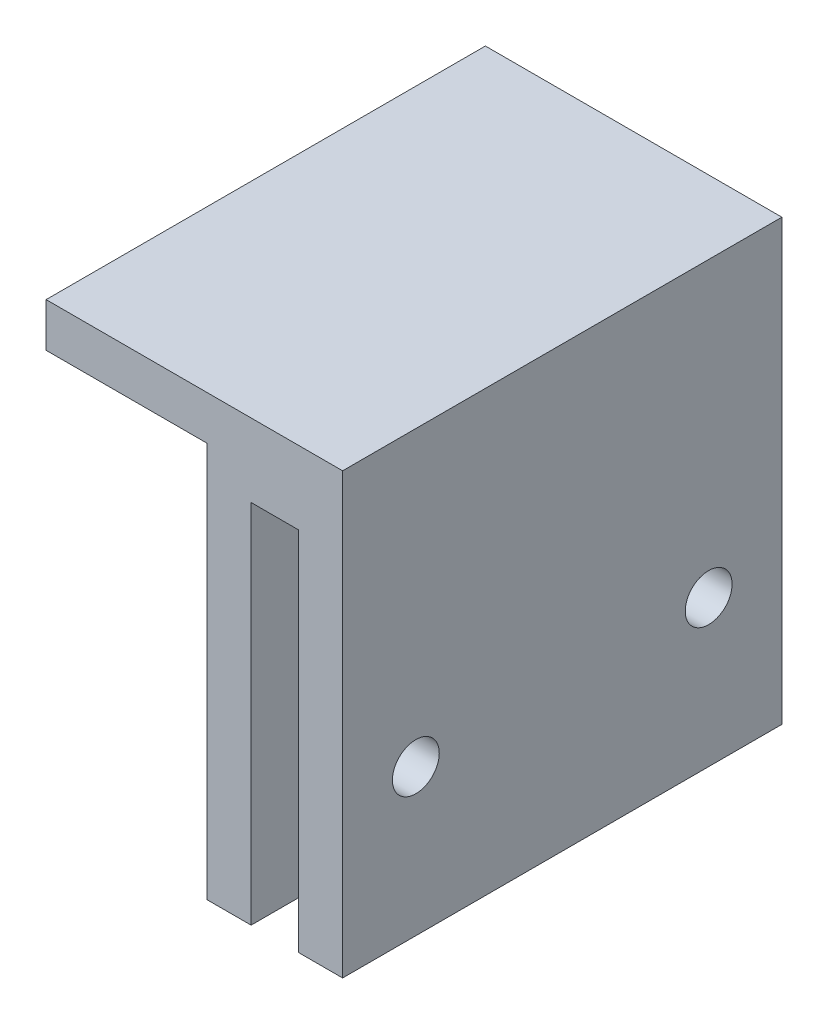
ISO-10303-21;
HEADER;
FILE_DESCRIPTION(('STEP AP214'),'2;1');
FILE_NAME('part.step','',(''),(''),'','','');
FILE_SCHEMA(('AUTOMOTIVE_DESIGN { 1 0 10303 214 1 1 1 1 }'));
ENDSEC;
DATA;
#1=APPLICATION_CONTEXT('core data for automotive mechanical design processes');
#2=APPLICATION_PROTOCOL_DEFINITION('international standard','automotive_design',2000,#1);
#3=PRODUCT_CONTEXT('',#1,'mechanical');
#4=PRODUCT('Part','Part','',(#3));
#5=PRODUCT_RELATED_PRODUCT_CATEGORY('part','',(#4));
#6=PRODUCT_DEFINITION_FORMATION('','',#4);
#7=PRODUCT_DEFINITION_CONTEXT('part definition',#1,'design');
#8=PRODUCT_DEFINITION('design','',#6,#7);
#9=PRODUCT_DEFINITION_SHAPE('','',#8);
#10=(LENGTH_UNIT() NAMED_UNIT(*) SI_UNIT(.MILLI.,.METRE.));
#11=(NAMED_UNIT(*) PLANE_ANGLE_UNIT() SI_UNIT($,.RADIAN.));
#12=(NAMED_UNIT(*) SI_UNIT($,.STERADIAN.) SOLID_ANGLE_UNIT());
#13=UNCERTAINTY_MEASURE_WITH_UNIT(LENGTH_MEASURE(1.E-05),#10,'distance_accuracy_value','');
#14=(GEOMETRIC_REPRESENTATION_CONTEXT(3) GLOBAL_UNCERTAINTY_ASSIGNED_CONTEXT((#13)) GLOBAL_UNIT_ASSIGNED_CONTEXT((#10,
#11,#12)) REPRESENTATION_CONTEXT('',''));
#15=CARTESIAN_POINT('',(0.,0.,0.));
#16=DIRECTION('',(0.,0.,1.));
#17=DIRECTION('',(1.,0.,0.));
#18=AXIS2_PLACEMENT_3D('',#15,#16,#17);
#19=CARTESIAN_POINT('',(-9.25,0.,0.));
#20=DIRECTION('',(1.,0.,0.));
#21=DIRECTION('',(0.,0.,-1.));
#22=AXIS2_PLACEMENT_3D('',#19,#20,#21);
#23=PLANE('',#22);
#24=CARTESIAN_POINT('',(-9.25,10.,-5.));
#25=DIRECTION('',(1.,0.,0.));
#26=DIRECTION('',(0.,0.,-1.));
#27=AXIS2_PLACEMENT_3D('',#24,#25,#26);
#28=CIRCLE('',#27,1.6);
#29=CARTESIAN_POINT('',(-9.25,10.,-6.6));
#30=VERTEX_POINT('',#29);
#31=EDGE_CURVE('E184',#30,#30,#28,.T.);
#32=ORIENTED_EDGE('',*,*,#31,.T.);
#33=EDGE_LOOP('',(#32));
#34=FACE_BOUND('',#33,.T.);
#35=CARTESIAN_POINT('',(-9.25,10.,-25.));
#36=DIRECTION('',(1.,0.,0.));
#37=DIRECTION('',(0.,0.,-1.));
#38=AXIS2_PLACEMENT_3D('',#35,#36,#37);
#39=CIRCLE('',#38,1.6);
#40=CARTESIAN_POINT('',(-9.25,10.,-26.6));
#41=VERTEX_POINT('',#40);
#42=EDGE_CURVE('E178',#41,#41,#39,.T.);
#43=ORIENTED_EDGE('',*,*,#42,.T.);
#44=EDGE_LOOP('',(#43));
#45=FACE_BOUND('',#44,.T.);
#46=DIRECTION('',(0.,0.,1.));
#47=VECTOR('',#46,1.);
#48=CARTESIAN_POINT('',(-9.25,27.,-30.));
#49=LINE('',#48,#47);
#50=CARTESIAN_POINT('',(-9.25,27.,-30.));
#51=VERTEX_POINT('',#50);
#52=CARTESIAN_POINT('',(-9.25,27.,0.));
#53=VERTEX_POINT('',#52);
#54=EDGE_CURVE('E51',#51,#53,#49,.T.);
#55=ORIENTED_EDGE('',*,*,#54,.F.);
#56=DIRECTION('',(0.,1.,0.));
#57=VECTOR('',#56,1.);
#58=CARTESIAN_POINT('',(-9.25,0.,-30.));
#59=LINE('',#58,#57);
#60=CARTESIAN_POINT('',(-9.25,0.,-30.));
#61=VERTEX_POINT('',#60);
#62=EDGE_CURVE('E195',#61,#51,#59,.T.);
#63=ORIENTED_EDGE('',*,*,#62,.F.);
#64=DIRECTION('',(0.,0.,-1.));
#65=VECTOR('',#64,1.);
#66=CARTESIAN_POINT('',(-9.25,0.,0.));
#67=LINE('',#66,#65);
#68=CARTESIAN_POINT('',(-9.25,0.,0.));
#69=VERTEX_POINT('',#68);
#70=EDGE_CURVE('E192',#69,#61,#67,.T.);
#71=ORIENTED_EDGE('',*,*,#70,.F.);
#72=DIRECTION('',(0.,-1.,0.));
#73=VECTOR('',#72,1.);
#74=CARTESIAN_POINT('',(-9.25,30.,0.));
#75=LINE('',#74,#73);
#76=EDGE_CURVE('E190',#53,#69,#75,.T.);
#77=ORIENTED_EDGE('',*,*,#76,.F.);
#78=EDGE_LOOP('',(#55,#63,#71,#77));
#79=FACE_BOUND('',#78,.T.);
#80=ADVANCED_FACE('F34',(#34,#45,#79),#23,.F.);
#81=CARTESIAN_POINT('',(-9.25,0.,0.));
#82=DIRECTION('',(0.,-1.,0.));
#83=DIRECTION('',(0.,0.,-1.));
#84=AXIS2_PLACEMENT_3D('',#81,#82,#83);
#85=PLANE('',#84);
#86=DIRECTION('',(0.,0.,1.));
#87=VECTOR('',#86,1.);
#88=CARTESIAN_POINT('',(-6.25000000000001,0.,-30.));
#89=LINE('',#88,#87);
#90=CARTESIAN_POINT('',(-6.25000000000001,0.,-30.));
#91=VERTEX_POINT('',#90);
#92=CARTESIAN_POINT('',(-6.25000000000001,0.,0.));
#93=VERTEX_POINT('',#92);
#94=EDGE_CURVE('E162',#91,#93,#89,.T.);
#95=ORIENTED_EDGE('',*,*,#94,.T.);
#96=DIRECTION('',(1.,0.,0.));
#97=VECTOR('',#96,1.);
#98=CARTESIAN_POINT('',(-9.25,0.,0.));
#99=LINE('',#98,#97);
#100=EDGE_CURVE('E209',#69,#93,#99,.T.);
#101=ORIENTED_EDGE('',*,*,#100,.F.);
#102=ORIENTED_EDGE('',*,*,#70,.T.);
#103=DIRECTION('',(1.,0.,0.));
#104=VECTOR('',#103,1.);
#105=CARTESIAN_POINT('',(-9.25,0.,-30.));
#106=LINE('',#105,#104);
#107=EDGE_CURVE('E122',#61,#91,#106,.T.);
#108=ORIENTED_EDGE('',*,*,#107,.T.);
#109=EDGE_LOOP('',(#95,#101,#102,#108));
#110=FACE_BOUND('',#109,.T.);
#111=ADVANCED_FACE('F254',(#110),#85,.T.);
#112=CARTESIAN_POINT('',(-9.25,10.,-5.));
#113=DIRECTION('',(1.,0.,0.));
#114=DIRECTION('',(0.,0.,-1.));
#115=AXIS2_PLACEMENT_3D('',#112,#113,#114);
#116=CYLINDRICAL_SURFACE('',#115,1.6);
#117=CARTESIAN_POINT('',(-6.25000000000001,10.,-5.));
#118=DIRECTION('',(-1.,0.,0.));
#119=DIRECTION('',(0.,0.,1.));
#120=AXIS2_PLACEMENT_3D('',#117,#118,#119);
#121=CIRCLE('',#120,1.6);
#122=CARTESIAN_POINT('',(-6.25000000000001,10.,-3.4));
#123=VERTEX_POINT('',#122);
#124=EDGE_CURVE('E174',#123,#123,#121,.F.);
#125=ORIENTED_EDGE('',*,*,#124,.T.);
#126=EDGE_LOOP('',(#125));
#127=FACE_BOUND('',#126,.T.);
#128=ORIENTED_EDGE('',*,*,#31,.F.);
#129=EDGE_LOOP('',(#128));
#130=FACE_BOUND('',#129,.T.);
#131=ADVANCED_FACE('F232',(#127,#130),#116,.F.);
#132=CARTESIAN_POINT('',(-9.25,10.,-25.));
#133=DIRECTION('',(1.,0.,0.));
#134=DIRECTION('',(0.,0.,-1.));
#135=AXIS2_PLACEMENT_3D('',#132,#133,#134);
#136=CYLINDRICAL_SURFACE('',#135,1.6);
#137=CARTESIAN_POINT('',(-6.25000000000001,10.,-25.));
#138=DIRECTION('',(-1.,0.,0.));
#139=DIRECTION('',(0.,0.,1.));
#140=AXIS2_PLACEMENT_3D('',#137,#138,#139);
#141=CIRCLE('',#140,1.6);
#142=CARTESIAN_POINT('',(-6.25000000000001,10.,-23.4));
#143=VERTEX_POINT('',#142);
#144=EDGE_CURVE('E38',#143,#143,#141,.F.);
#145=ORIENTED_EDGE('',*,*,#144,.T.);
#146=EDGE_LOOP('',(#145));
#147=FACE_BOUND('',#146,.T.);
#148=ORIENTED_EDGE('',*,*,#42,.F.);
#149=EDGE_LOOP('',(#148));
#150=FACE_BOUND('',#149,.T.);
#151=ADVANCED_FACE('F301',(#147,#150),#136,.F.);
#152=CARTESIAN_POINT('',(-9.25,30.,0.));
#153=DIRECTION('',(0.,0.,1.));
#154=DIRECTION('',(0.,-1.,0.));
#155=AXIS2_PLACEMENT_3D('',#152,#153,#154);
#156=PLANE('',#155);
#157=DIRECTION('',(0.,-1.,0.));
#158=VECTOR('',#157,1.);
#159=CARTESIAN_POINT('',(-6.25000000000001,0.,0.));
#160=LINE('',#159,#158);
#161=CARTESIAN_POINT('',(-6.25000000000001,25.,0.));
#162=VERTEX_POINT('',#161);
#163=EDGE_CURVE('E150',#162,#93,#160,.T.);
#164=ORIENTED_EDGE('',*,*,#163,.F.);
#165=DIRECTION('',(-1.,0.,0.));
#166=VECTOR('',#165,1.);
#167=CARTESIAN_POINT('',(-6.25000000000001,25.,0.));
#168=LINE('',#167,#166);
#169=CARTESIAN_POINT('',(-3.00000000000001,25.,0.));
#170=VERTEX_POINT('',#169);
#171=EDGE_CURVE('E158',#170,#162,#168,.T.);
#172=ORIENTED_EDGE('',*,*,#171,.F.);
#173=DIRECTION('',(0.,1.,0.));
#174=VECTOR('',#173,1.);
#175=CARTESIAN_POINT('',(-3.00000000000001,25.,0.));
#176=LINE('',#175,#174);
#177=CARTESIAN_POINT('',(-3.00000000000001,0.,0.));
#178=VERTEX_POINT('',#177);
#179=EDGE_CURVE('E147',#178,#170,#176,.T.);
#180=ORIENTED_EDGE('',*,*,#179,.F.);
#181=CARTESIAN_POINT('',(0.,0.,0.));
#182=VERTEX_POINT('',#181);
#183=EDGE_CURVE('E197',#178,#182,#99,.T.);
#184=ORIENTED_EDGE('',*,*,#183,.T.);
#185=DIRECTION('',(0.,-1.,0.));
#186=VECTOR('',#185,1.);
#187=CARTESIAN_POINT('',(0.,30.,0.));
#188=LINE('',#187,#186);
#189=CARTESIAN_POINT('',(0.,30.,0.));
#190=VERTEX_POINT('',#189);
#191=EDGE_CURVE('E187',#190,#182,#188,.T.);
#192=ORIENTED_EDGE('',*,*,#191,.F.);
#193=DIRECTION('',(1.,0.,0.));
#194=VECTOR('',#193,1.);
#195=CARTESIAN_POINT('',(-9.25,30.,0.));
#196=LINE('',#195,#194);
#197=CARTESIAN_POINT('',(-20.25,30.,0.));
#198=VERTEX_POINT('',#197);
#199=EDGE_CURVE('E11',#198,#190,#196,.T.);
#200=ORIENTED_EDGE('',*,*,#199,.F.);
#201=DIRECTION('',(0.,1.,0.));
#202=VECTOR('',#201,1.);
#203=CARTESIAN_POINT('',(-20.25,27.,0.));
#204=LINE('',#203,#202);
#205=CARTESIAN_POINT('',(-20.25,27.,0.));
#206=VERTEX_POINT('',#205);
#207=EDGE_CURVE('E137',#206,#198,#204,.T.);
#208=ORIENTED_EDGE('',*,*,#207,.F.);
#209=DIRECTION('',(1.,0.,0.));
#210=VECTOR('',#209,1.);
#211=CARTESIAN_POINT('',(-20.25,27.,0.));
#212=LINE('',#211,#210);
#213=EDGE_CURVE('E142',#206,#53,#212,.T.);
#214=ORIENTED_EDGE('',*,*,#213,.T.);
#215=ORIENTED_EDGE('',*,*,#76,.T.);
#216=ORIENTED_EDGE('',*,*,#100,.T.);
#217=EDGE_LOOP('',(#164,#172,#180,#184,#192,#200,#208,#214,#215,#216));
#218=FACE_BOUND('',#217,.T.);
#219=ADVANCED_FACE('F36',(#218),#156,.T.);
#220=CARTESIAN_POINT('',(-9.25,30.,-30.));
#221=DIRECTION('',(0.,1.,0.));
#222=DIRECTION('',(0.,0.,1.));
#223=AXIS2_PLACEMENT_3D('',#220,#221,#222);
#224=PLANE('',#223);
#225=DIRECTION('',(0.,0.,1.));
#226=VECTOR('',#225,1.);
#227=CARTESIAN_POINT('',(0.,30.,-30.));
#228=LINE('',#227,#226);
#229=CARTESIAN_POINT('',(0.,30.,-30.));
#230=VERTEX_POINT('',#229);
#231=EDGE_CURVE('E118',#230,#190,#228,.T.);
#232=ORIENTED_EDGE('',*,*,#231,.F.);
#233=DIRECTION('',(1.,0.,0.));
#234=VECTOR('',#233,1.);
#235=CARTESIAN_POINT('',(-9.25,30.,-30.));
#236=LINE('',#235,#234);
#237=CARTESIAN_POINT('',(-20.25,30.,-30.));
#238=VERTEX_POINT('',#237);
#239=EDGE_CURVE('E43',#238,#230,#236,.T.);
#240=ORIENTED_EDGE('',*,*,#239,.F.);
#241=DIRECTION('',(0.,0.,-1.));
#242=VECTOR('',#241,1.);
#243=CARTESIAN_POINT('',(-20.25,30.,0.));
#244=LINE('',#243,#242);
#245=EDGE_CURVE('E116',#198,#238,#244,.T.);
#246=ORIENTED_EDGE('',*,*,#245,.F.);
#247=ORIENTED_EDGE('',*,*,#199,.T.);
#248=EDGE_LOOP('',(#232,#240,#246,#247));
#249=FACE_BOUND('',#248,.T.);
#250=ADVANCED_FACE('F114',(#249),#224,.T.);
#251=CARTESIAN_POINT('',(-9.25,0.,-30.));
#252=DIRECTION('',(0.,0.,-1.));
#253=DIRECTION('',(-1.,0.,0.));
#254=AXIS2_PLACEMENT_3D('',#251,#252,#253);
#255=PLANE('',#254);
#256=DIRECTION('',(0.,-1.,0.));
#257=VECTOR('',#256,1.);
#258=CARTESIAN_POINT('',(-6.25000000000001,0.,-30.));
#259=LINE('',#258,#257);
#260=CARTESIAN_POINT('',(-6.25000000000001,25.,-30.));
#261=VERTEX_POINT('',#260);
#262=EDGE_CURVE('E153',#261,#91,#259,.T.);
#263=ORIENTED_EDGE('',*,*,#262,.T.);
#264=ORIENTED_EDGE('',*,*,#107,.F.);
#265=ORIENTED_EDGE('',*,*,#62,.T.);
#266=DIRECTION('',(1.,0.,0.));
#267=VECTOR('',#266,1.);
#268=CARTESIAN_POINT('',(-20.25,27.,-30.));
#269=LINE('',#268,#267);
#270=CARTESIAN_POINT('',(-20.25,27.,-30.));
#271=VERTEX_POINT('',#270);
#272=EDGE_CURVE('E129',#271,#51,#269,.T.);
#273=ORIENTED_EDGE('',*,*,#272,.F.);
#274=DIRECTION('',(0.,-1.,0.));
#275=VECTOR('',#274,1.);
#276=CARTESIAN_POINT('',(-20.25,30.,-30.));
#277=LINE('',#276,#275);
#278=EDGE_CURVE('E125',#238,#271,#277,.T.);
#279=ORIENTED_EDGE('',*,*,#278,.F.);
#280=ORIENTED_EDGE('',*,*,#239,.T.);
#281=DIRECTION('',(0.,1.,0.));
#282=VECTOR('',#281,1.);
#283=CARTESIAN_POINT('',(0.,0.,-30.));
#284=LINE('',#283,#282);
#285=CARTESIAN_POINT('',(0.,0.,-30.));
#286=VERTEX_POINT('',#285);
#287=EDGE_CURVE('E203',#286,#230,#284,.T.);
#288=ORIENTED_EDGE('',*,*,#287,.F.);
#289=CARTESIAN_POINT('',(-3.,0.,-30.));
#290=VERTEX_POINT('',#289);
#291=EDGE_CURVE('E208',#290,#286,#106,.T.);
#292=ORIENTED_EDGE('',*,*,#291,.F.);
#293=DIRECTION('',(0.,1.,0.));
#294=VECTOR('',#293,1.);
#295=CARTESIAN_POINT('',(-3.00000000000001,25.,-30.));
#296=LINE('',#295,#294);
#297=CARTESIAN_POINT('',(-3.00000000000001,25.,-30.));
#298=VERTEX_POINT('',#297);
#299=EDGE_CURVE('E59',#290,#298,#296,.T.);
#300=ORIENTED_EDGE('',*,*,#299,.T.);
#301=DIRECTION('',(-1.,0.,0.));
#302=VECTOR('',#301,1.);
#303=CARTESIAN_POINT('',(-6.25000000000001,25.,-30.));
#304=LINE('',#303,#302);
#305=EDGE_CURVE('E149',#298,#261,#304,.T.);
#306=ORIENTED_EDGE('',*,*,#305,.T.);
#307=EDGE_LOOP('',(#263,#264,#265,#273,#279,#280,#288,#292,#300,#306));
#308=FACE_BOUND('',#307,.T.);
#309=ADVANCED_FACE('F127',(#308),#255,.T.);
#310=DIRECTION('',(0.,0.,1.));
#311=VECTOR('',#310,1.);
#312=CARTESIAN_POINT('',(-3.00000000000001,0.,-30.));
#313=LINE('',#312,#311);
#314=EDGE_CURVE('E155',#290,#178,#313,.T.);
#315=ORIENTED_EDGE('',*,*,#314,.F.);
#316=ORIENTED_EDGE('',*,*,#291,.T.);
#317=DIRECTION('',(0.,0.,-1.));
#318=VECTOR('',#317,1.);
#319=CARTESIAN_POINT('',(0.,0.,0.));
#320=LINE('',#319,#318);
#321=EDGE_CURVE('E200',#182,#286,#320,.T.);
#322=ORIENTED_EDGE('',*,*,#321,.F.);
#323=ORIENTED_EDGE('',*,*,#183,.F.);
#324=EDGE_LOOP('',(#315,#316,#322,#323));
#325=FACE_BOUND('',#324,.T.);
#326=ADVANCED_FACE('F237',(#325),#85,.T.);
#327=CARTESIAN_POINT('',(0.,0.,0.));
#328=DIRECTION('',(1.,0.,0.));
#329=DIRECTION('',(0.,0.,-1.));
#330=AXIS2_PLACEMENT_3D('',#327,#328,#329);
#331=PLANE('',#330);
#332=CARTESIAN_POINT('',(0.,10.,-25.));
#333=DIRECTION('',(1.,0.,0.));
#334=DIRECTION('',(0.,0.,-1.));
#335=AXIS2_PLACEMENT_3D('',#332,#333,#334);
#336=CIRCLE('',#335,1.6);
#337=CARTESIAN_POINT('',(0.,10.,-26.6));
#338=VERTEX_POINT('',#337);
#339=EDGE_CURVE('E177',#338,#338,#336,.T.);
#340=ORIENTED_EDGE('',*,*,#339,.F.);
#341=EDGE_LOOP('',(#340));
#342=FACE_BOUND('',#341,.T.);
#343=CARTESIAN_POINT('',(0.,10.,-5.));
#344=DIRECTION('',(1.,0.,0.));
#345=DIRECTION('',(0.,0.,-1.));
#346=AXIS2_PLACEMENT_3D('',#343,#344,#345);
#347=CIRCLE('',#346,1.6);
#348=CARTESIAN_POINT('',(0.,10.,-6.6));
#349=VERTEX_POINT('',#348);
#350=EDGE_CURVE('E181',#349,#349,#347,.T.);
#351=ORIENTED_EDGE('',*,*,#350,.F.);
#352=EDGE_LOOP('',(#351));
#353=FACE_BOUND('',#352,.T.);
#354=ORIENTED_EDGE('',*,*,#191,.T.);
#355=ORIENTED_EDGE('',*,*,#321,.T.);
#356=ORIENTED_EDGE('',*,*,#287,.T.);
#357=ORIENTED_EDGE('',*,*,#231,.T.);
#358=EDGE_LOOP('',(#354,#355,#356,#357));
#359=FACE_BOUND('',#358,.T.);
#360=ADVANCED_FACE('F230',(#342,#353,#359),#331,.T.);
#361=CARTESIAN_POINT('',(-3.00000000000001,10.,-5.));
#362=DIRECTION('',(1.,0.,0.));
#363=DIRECTION('',(0.,1.,0.));
#364=AXIS2_PLACEMENT_3D('',#361,#362,#363);
#365=CIRCLE('',#364,1.6);
#366=CARTESIAN_POINT('',(-3.00000000000001,11.6,-5.));
#367=VERTEX_POINT('',#366);
#368=EDGE_CURVE('E171',#367,#367,#365,.F.);
#369=ORIENTED_EDGE('',*,*,#368,.T.);
#370=EDGE_LOOP('',(#369));
#371=FACE_BOUND('',#370,.T.);
#372=ORIENTED_EDGE('',*,*,#350,.T.);
#373=EDGE_LOOP('',(#372));
#374=FACE_BOUND('',#373,.T.);
#375=ADVANCED_FACE('F227',(#371,#374),#116,.F.);
#376=CARTESIAN_POINT('',(-3.00000000000001,10.,-25.));
#377=DIRECTION('',(1.,0.,0.));
#378=DIRECTION('',(0.,1.,0.));
#379=AXIS2_PLACEMENT_3D('',#376,#377,#378);
#380=CIRCLE('',#379,1.6);
#381=CARTESIAN_POINT('',(-3.00000000000001,11.6,-25.));
#382=VERTEX_POINT('',#381);
#383=EDGE_CURVE('E165',#382,#382,#380,.F.);
#384=ORIENTED_EDGE('',*,*,#383,.T.);
#385=EDGE_LOOP('',(#384));
#386=FACE_BOUND('',#385,.T.);
#387=ORIENTED_EDGE('',*,*,#339,.T.);
#388=EDGE_LOOP('',(#387));
#389=FACE_BOUND('',#388,.T.);
#390=ADVANCED_FACE('F214',(#386,#389),#136,.F.);
#391=CARTESIAN_POINT('',(-6.25000000000001,0.,-30.));
#392=DIRECTION('',(-1.,0.,0.));
#393=DIRECTION('',(0.,0.,1.));
#394=AXIS2_PLACEMENT_3D('',#391,#392,#393);
#395=PLANE('',#394);
#396=ORIENTED_EDGE('',*,*,#144,.F.);
#397=EDGE_LOOP('',(#396));
#398=FACE_BOUND('',#397,.T.);
#399=ORIENTED_EDGE('',*,*,#163,.T.);
#400=ORIENTED_EDGE('',*,*,#94,.F.);
#401=ORIENTED_EDGE('',*,*,#262,.F.);
#402=DIRECTION('',(0.,0.,1.));
#403=VECTOR('',#402,1.);
#404=CARTESIAN_POINT('',(-6.25000000000001,25.,-30.));
#405=LINE('',#404,#403);
#406=EDGE_CURVE('E166',#261,#162,#405,.T.);
#407=ORIENTED_EDGE('',*,*,#406,.T.);
#408=EDGE_LOOP('',(#399,#400,#401,#407));
#409=FACE_BOUND('',#408,.T.);
#410=ORIENTED_EDGE('',*,*,#124,.F.);
#411=EDGE_LOOP('',(#410));
#412=FACE_BOUND('',#411,.T.);
#413=ADVANCED_FACE('F220',(#398,#409,#412),#395,.F.);
#414=CARTESIAN_POINT('',(-3.00000000000001,25.,-30.));
#415=DIRECTION('',(1.,0.,0.));
#416=DIRECTION('',(0.,1.,0.));
#417=AXIS2_PLACEMENT_3D('',#414,#415,#416);
#418=PLANE('',#417);
#419=ORIENTED_EDGE('',*,*,#383,.F.);
#420=EDGE_LOOP('',(#419));
#421=FACE_BOUND('',#420,.T.);
#422=ORIENTED_EDGE('',*,*,#179,.T.);
#423=DIRECTION('',(0.,0.,1.));
#424=VECTOR('',#423,1.);
#425=CARTESIAN_POINT('',(-3.00000000000001,25.,-30.));
#426=LINE('',#425,#424);
#427=EDGE_CURVE('E168',#298,#170,#426,.T.);
#428=ORIENTED_EDGE('',*,*,#427,.F.);
#429=ORIENTED_EDGE('',*,*,#299,.F.);
#430=ORIENTED_EDGE('',*,*,#314,.T.);
#431=EDGE_LOOP('',(#422,#428,#429,#430));
#432=FACE_BOUND('',#431,.T.);
#433=ORIENTED_EDGE('',*,*,#368,.F.);
#434=EDGE_LOOP('',(#433));
#435=FACE_BOUND('',#434,.T.);
#436=ADVANCED_FACE('F217',(#421,#432,#435),#418,.F.);
#437=CARTESIAN_POINT('',(-6.25000000000001,25.,-30.));
#438=DIRECTION('',(0.,1.,0.));
#439=DIRECTION('',(0.,0.,1.));
#440=AXIS2_PLACEMENT_3D('',#437,#438,#439);
#441=PLANE('',#440);
#442=ORIENTED_EDGE('',*,*,#171,.T.);
#443=ORIENTED_EDGE('',*,*,#406,.F.);
#444=ORIENTED_EDGE('',*,*,#305,.F.);
#445=ORIENTED_EDGE('',*,*,#427,.T.);
#446=EDGE_LOOP('',(#442,#443,#444,#445));
#447=FACE_BOUND('',#446,.T.);
#448=ADVANCED_FACE('F219',(#447),#441,.F.);
#449=CARTESIAN_POINT('',(-20.25,27.,-30.));
#450=DIRECTION('',(0.,1.,0.));
#451=DIRECTION('',(0.,0.,1.));
#452=AXIS2_PLACEMENT_3D('',#449,#450,#451);
#453=PLANE('',#452);
#454=ORIENTED_EDGE('',*,*,#54,.T.);
#455=ORIENTED_EDGE('',*,*,#213,.F.);
#456=DIRECTION('',(0.,0.,1.));
#457=VECTOR('',#456,1.);
#458=CARTESIAN_POINT('',(-20.25,27.,-30.));
#459=LINE('',#458,#457);
#460=EDGE_CURVE('E132',#271,#206,#459,.T.);
#461=ORIENTED_EDGE('',*,*,#460,.F.);
#462=ORIENTED_EDGE('',*,*,#272,.T.);
#463=EDGE_LOOP('',(#454,#455,#461,#462));
#464=FACE_BOUND('',#463,.T.);
#465=ADVANCED_FACE('F258',(#464),#453,.F.);
#466=CARTESIAN_POINT('',(-20.25,0.,0.));
#467=DIRECTION('',(-1.,0.,0.));
#468=DIRECTION('',(0.,0.,1.));
#469=AXIS2_PLACEMENT_3D('',#466,#467,#468);
#470=PLANE('',#469);
#471=ORIENTED_EDGE('',*,*,#245,.T.);
#472=ORIENTED_EDGE('',*,*,#278,.T.);
#473=ORIENTED_EDGE('',*,*,#460,.T.);
#474=ORIENTED_EDGE('',*,*,#207,.T.);
#475=EDGE_LOOP('',(#471,#472,#473,#474));
#476=FACE_BOUND('',#475,.T.);
#477=ADVANCED_FACE('F135',(#476),#470,.T.);
#478=CLOSED_SHELL('',(#80,#111,#131,#151,#219,#250,#309,#326,#360,#375,#390,#413,#436,#448,#465,#477));
#479=MANIFOLD_SOLID_BREP('B2',#478);
#480=ADVANCED_BREP_SHAPE_REPRESENTATION('',(#18,#479),#14);
#481=SHAPE_DEFINITION_REPRESENTATION(#9,#480);
ENDSEC;
END-ISO-10303-21;
